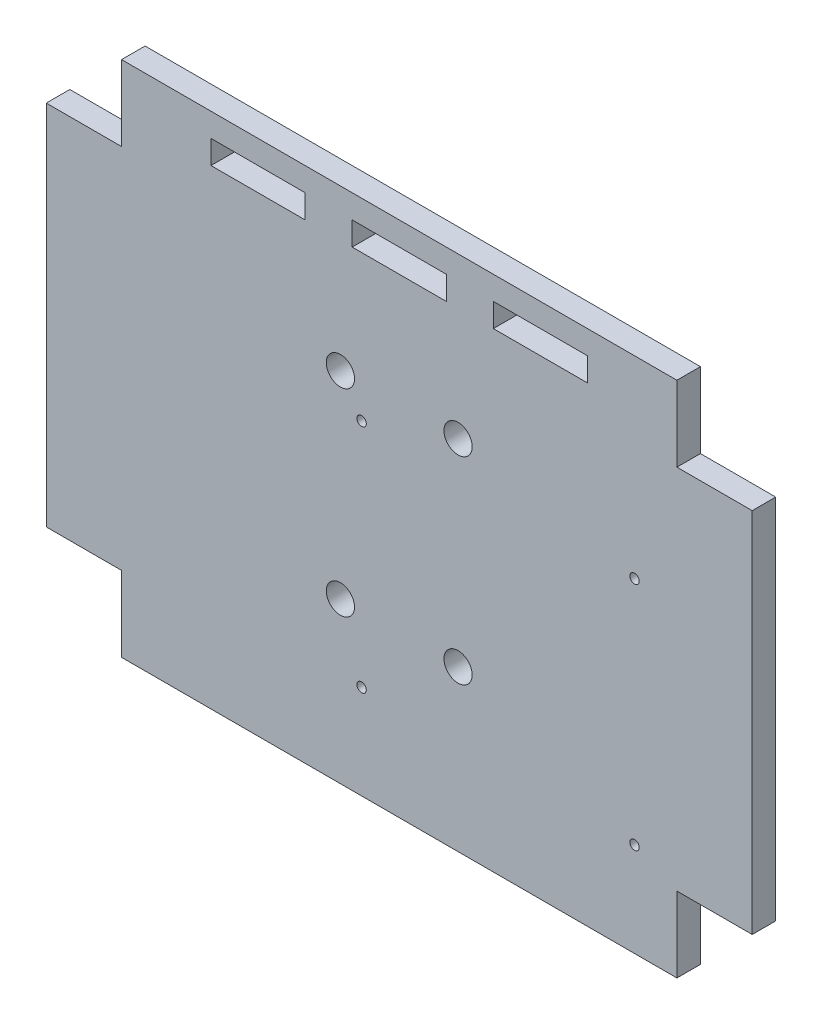
ISO-10303-21;
HEADER;
FILE_DESCRIPTION(('STEP AP214'),'2;1');
FILE_NAME('part.step','',(''),(''),'','','');
FILE_SCHEMA(('AUTOMOTIVE_DESIGN { 1 0 10303 214 1 1 1 1 }'));
ENDSEC;
DATA;
#1=APPLICATION_CONTEXT('core data for automotive mechanical design processes');
#2=APPLICATION_PROTOCOL_DEFINITION('international standard','automotive_design',2000,#1);
#3=PRODUCT_CONTEXT('',#1,'mechanical');
#4=PRODUCT('Part','Part','',(#3));
#5=PRODUCT_RELATED_PRODUCT_CATEGORY('part','',(#4));
#6=PRODUCT_DEFINITION_FORMATION('','',#4);
#7=PRODUCT_DEFINITION_CONTEXT('part definition',#1,'design');
#8=PRODUCT_DEFINITION('design','',#6,#7);
#9=PRODUCT_DEFINITION_SHAPE('','',#8);
#10=(LENGTH_UNIT() NAMED_UNIT(*) SI_UNIT(.MILLI.,.METRE.));
#11=(NAMED_UNIT(*) PLANE_ANGLE_UNIT() SI_UNIT($,.RADIAN.));
#12=(NAMED_UNIT(*) SI_UNIT($,.STERADIAN.) SOLID_ANGLE_UNIT());
#13=UNCERTAINTY_MEASURE_WITH_UNIT(LENGTH_MEASURE(1.E-05),#10,'distance_accuracy_value','');
#14=(GEOMETRIC_REPRESENTATION_CONTEXT(3) GLOBAL_UNCERTAINTY_ASSIGNED_CONTEXT((#13)) GLOBAL_UNIT_ASSIGNED_CONTEXT((#10,
#11,#12)) REPRESENTATION_CONTEXT('',''));
#15=CARTESIAN_POINT('',(0.,0.,0.));
#16=DIRECTION('',(0.,0.,1.));
#17=DIRECTION('',(1.,0.,0.));
#18=AXIS2_PLACEMENT_3D('',#15,#16,#17);
#19=CARTESIAN_POINT('',(-34.,-55.,-5.));
#20=DIRECTION('',(-1.,0.,0.));
#21=DIRECTION('',(0.,-1.,0.));
#22=AXIS2_PLACEMENT_3D('',#19,#20,#21);
#23=PLANE('',#22);
#24=DIRECTION('',(0.,-1.,0.));
#25=VECTOR('',#24,1.);
#26=CARTESIAN_POINT('',(-34.,-55.,0.));
#27=LINE('',#26,#25);
#28=CARTESIAN_POINT('',(-34.,-39.,0.));
#29=VERTEX_POINT('',#28);
#30=CARTESIAN_POINT('',(-34.,-55.,0.));
#31=VERTEX_POINT('',#30);
#32=EDGE_CURVE('E341',#29,#31,#27,.T.);
#33=ORIENTED_EDGE('',*,*,#32,.F.);
#34=DIRECTION('',(0.,0.,1.));
#35=VECTOR('',#34,1.);
#36=CARTESIAN_POINT('',(-34.,-39.,-5.));
#37=LINE('',#36,#35);
#38=CARTESIAN_POINT('',(-34.,-39.,-5.));
#39=VERTEX_POINT('',#38);
#40=EDGE_CURVE('E11',#39,#29,#37,.T.);
#41=ORIENTED_EDGE('',*,*,#40,.F.);
#42=DIRECTION('',(0.,-1.,0.));
#43=VECTOR('',#42,1.);
#44=CARTESIAN_POINT('',(-34.,-55.,-5.));
#45=LINE('',#44,#43);
#46=CARTESIAN_POINT('',(-34.,-55.,-5.));
#47=VERTEX_POINT('',#46);
#48=EDGE_CURVE('E344',#39,#47,#45,.T.);
#49=ORIENTED_EDGE('',*,*,#48,.T.);
#50=DIRECTION('',(0.,0.,1.));
#51=VECTOR('',#50,1.);
#52=CARTESIAN_POINT('',(-34.,-55.,-5.));
#53=LINE('',#52,#51);
#54=EDGE_CURVE('E36',#47,#31,#53,.T.);
#55=ORIENTED_EDGE('',*,*,#54,.T.);
#56=EDGE_LOOP('',(#33,#41,#49,#55));
#57=FACE_BOUND('',#56,.T.);
#58=ADVANCED_FACE('F33',(#57),#23,.T.);
#59=CARTESIAN_POINT('',(-50.,-39.,-5.));
#60=DIRECTION('',(0.,-1.,0.));
#61=DIRECTION('',(0.,0.,-1.));
#62=AXIS2_PLACEMENT_3D('',#59,#60,#61);
#63=PLANE('',#62);
#64=DIRECTION('',(1.,0.,0.));
#65=VECTOR('',#64,1.);
#66=CARTESIAN_POINT('',(-50.,-39.,0.));
#67=LINE('',#66,#65);
#68=CARTESIAN_POINT('',(-50.,-39.,0.));
#69=VERTEX_POINT('',#68);
#70=EDGE_CURVE('E348',#69,#29,#67,.T.);
#71=ORIENTED_EDGE('',*,*,#70,.F.);
#72=DIRECTION('',(0.,0.,1.));
#73=VECTOR('',#72,1.);
#74=CARTESIAN_POINT('',(-50.,-39.,-5.));
#75=LINE('',#74,#73);
#76=CARTESIAN_POINT('',(-50.,-39.,-5.));
#77=VERTEX_POINT('',#76);
#78=EDGE_CURVE('E41',#77,#69,#75,.T.);
#79=ORIENTED_EDGE('',*,*,#78,.F.);
#80=DIRECTION('',(1.,0.,0.));
#81=VECTOR('',#80,1.);
#82=CARTESIAN_POINT('',(-50.,-39.,-5.));
#83=LINE('',#82,#81);
#84=EDGE_CURVE('E378',#77,#39,#83,.T.);
#85=ORIENTED_EDGE('',*,*,#84,.T.);
#86=ORIENTED_EDGE('',*,*,#40,.T.);
#87=EDGE_LOOP('',(#71,#79,#85,#86));
#88=FACE_BOUND('',#87,.T.);
#89=ADVANCED_FACE('F444',(#88),#63,.T.);
#90=CARTESIAN_POINT('',(-50.,39.,-5.));
#91=DIRECTION('',(-1.,0.,0.));
#92=DIRECTION('',(0.,-1.,0.));
#93=AXIS2_PLACEMENT_3D('',#90,#91,#92);
#94=PLANE('',#93);
#95=DIRECTION('',(0.,-1.,0.));
#96=VECTOR('',#95,1.);
#97=CARTESIAN_POINT('',(-50.,39.,0.));
#98=LINE('',#97,#96);
#99=CARTESIAN_POINT('',(-50.,39.,0.));
#100=VERTEX_POINT('',#99);
#101=EDGE_CURVE('E410',#100,#69,#98,.T.);
#102=ORIENTED_EDGE('',*,*,#101,.F.);
#103=DIRECTION('',(0.,0.,1.));
#104=VECTOR('',#103,1.);
#105=CARTESIAN_POINT('',(-50.,39.,-5.));
#106=LINE('',#105,#104);
#107=CARTESIAN_POINT('',(-50.,39.,-5.));
#108=VERTEX_POINT('',#107);
#109=EDGE_CURVE('E416',#108,#100,#106,.T.);
#110=ORIENTED_EDGE('',*,*,#109,.F.);
#111=DIRECTION('',(0.,-1.,0.));
#112=VECTOR('',#111,1.);
#113=CARTESIAN_POINT('',(-50.,39.,-5.));
#114=LINE('',#113,#112);
#115=EDGE_CURVE('E375',#108,#77,#114,.T.);
#116=ORIENTED_EDGE('',*,*,#115,.T.);
#117=ORIENTED_EDGE('',*,*,#78,.T.);
#118=EDGE_LOOP('',(#102,#110,#116,#117));
#119=FACE_BOUND('',#118,.T.);
#120=ADVANCED_FACE('F481',(#119),#94,.T.);
#121=CARTESIAN_POINT('',(-50.,39.,-5.));
#122=DIRECTION('',(0.,1.,0.));
#123=DIRECTION('',(0.,0.,1.));
#124=AXIS2_PLACEMENT_3D('',#121,#122,#123);
#125=PLANE('',#124);
#126=DIRECTION('',(-1.,0.,0.));
#127=VECTOR('',#126,1.);
#128=CARTESIAN_POINT('',(-50.,39.,0.));
#129=LINE('',#128,#127);
#130=CARTESIAN_POINT('',(-34.,39.,0.));
#131=VERTEX_POINT('',#130);
#132=EDGE_CURVE('E407',#131,#100,#129,.T.);
#133=ORIENTED_EDGE('',*,*,#132,.F.);
#134=DIRECTION('',(0.,0.,1.));
#135=VECTOR('',#134,1.);
#136=CARTESIAN_POINT('',(-34.,39.,-5.));
#137=LINE('',#136,#135);
#138=CARTESIAN_POINT('',(-34.,39.,-5.));
#139=VERTEX_POINT('',#138);
#140=EDGE_CURVE('E418',#139,#131,#137,.T.);
#141=ORIENTED_EDGE('',*,*,#140,.F.);
#142=DIRECTION('',(-1.,0.,0.));
#143=VECTOR('',#142,1.);
#144=CARTESIAN_POINT('',(-50.,39.,-5.));
#145=LINE('',#144,#143);
#146=EDGE_CURVE('E372',#139,#108,#145,.T.);
#147=ORIENTED_EDGE('',*,*,#146,.T.);
#148=ORIENTED_EDGE('',*,*,#109,.T.);
#149=EDGE_LOOP('',(#133,#141,#147,#148));
#150=FACE_BOUND('',#149,.T.);
#151=ADVANCED_FACE('F478',(#150),#125,.T.);
#152=CARTESIAN_POINT('',(-34.,55.,-5.));
#153=DIRECTION('',(-1.,0.,0.));
#154=DIRECTION('',(0.,-1.,0.));
#155=AXIS2_PLACEMENT_3D('',#152,#153,#154);
#156=PLANE('',#155);
#157=DIRECTION('',(0.,-1.,0.));
#158=VECTOR('',#157,1.);
#159=CARTESIAN_POINT('',(-34.,55.,0.));
#160=LINE('',#159,#158);
#161=CARTESIAN_POINT('',(-34.,55.,0.));
#162=VERTEX_POINT('',#161);
#163=EDGE_CURVE('E404',#162,#131,#160,.T.);
#164=ORIENTED_EDGE('',*,*,#163,.F.);
#165=DIRECTION('',(0.,0.,1.));
#166=VECTOR('',#165,1.);
#167=CARTESIAN_POINT('',(-34.,55.,-5.));
#168=LINE('',#167,#166);
#169=CARTESIAN_POINT('',(-34.,55.,-5.));
#170=VERTEX_POINT('',#169);
#171=EDGE_CURVE('E420',#170,#162,#168,.T.);
#172=ORIENTED_EDGE('',*,*,#171,.F.);
#173=DIRECTION('',(0.,-1.,0.));
#174=VECTOR('',#173,1.);
#175=CARTESIAN_POINT('',(-34.,55.,-5.));
#176=LINE('',#175,#174);
#177=EDGE_CURVE('E369',#170,#139,#176,.T.);
#178=ORIENTED_EDGE('',*,*,#177,.T.);
#179=ORIENTED_EDGE('',*,*,#140,.T.);
#180=EDGE_LOOP('',(#164,#172,#178,#179));
#181=FACE_BOUND('',#180,.T.);
#182=ADVANCED_FACE('F475',(#181),#156,.T.);
#183=CARTESIAN_POINT('',(-34.,55.,-5.));
#184=DIRECTION('',(0.,1.,0.));
#185=DIRECTION('',(0.,0.,1.));
#186=AXIS2_PLACEMENT_3D('',#183,#184,#185);
#187=PLANE('',#186);
#188=DIRECTION('',(-1.,0.,0.));
#189=VECTOR('',#188,1.);
#190=CARTESIAN_POINT('',(-34.,55.,0.));
#191=LINE('',#190,#189);
#192=CARTESIAN_POINT('',(84.,55.,0.));
#193=VERTEX_POINT('',#192);
#194=EDGE_CURVE('E401',#193,#162,#191,.T.);
#195=ORIENTED_EDGE('',*,*,#194,.F.);
#196=DIRECTION('',(0.,0.,1.));
#197=VECTOR('',#196,1.);
#198=CARTESIAN_POINT('',(84.,55.,-5.));
#199=LINE('',#198,#197);
#200=CARTESIAN_POINT('',(84.,55.,-5.));
#201=VERTEX_POINT('',#200);
#202=EDGE_CURVE('E422',#201,#193,#199,.T.);
#203=ORIENTED_EDGE('',*,*,#202,.F.);
#204=DIRECTION('',(-1.,0.,0.));
#205=VECTOR('',#204,1.);
#206=CARTESIAN_POINT('',(-34.,55.,-5.));
#207=LINE('',#206,#205);
#208=EDGE_CURVE('E366',#201,#170,#207,.T.);
#209=ORIENTED_EDGE('',*,*,#208,.T.);
#210=ORIENTED_EDGE('',*,*,#171,.T.);
#211=EDGE_LOOP('',(#195,#203,#209,#210));
#212=FACE_BOUND('',#211,.T.);
#213=ADVANCED_FACE('F471',(#212),#187,.T.);
#214=CARTESIAN_POINT('',(84.,55.,-5.));
#215=DIRECTION('',(1.,0.,0.));
#216=DIRECTION('',(0.,1.,0.));
#217=AXIS2_PLACEMENT_3D('',#214,#215,#216);
#218=PLANE('',#217);
#219=DIRECTION('',(0.,1.,0.));
#220=VECTOR('',#219,1.);
#221=CARTESIAN_POINT('',(84.,55.,0.));
#222=LINE('',#221,#220);
#223=CARTESIAN_POINT('',(84.,39.,0.));
#224=VERTEX_POINT('',#223);
#225=EDGE_CURVE('E398',#224,#193,#222,.T.);
#226=ORIENTED_EDGE('',*,*,#225,.F.);
#227=DIRECTION('',(0.,0.,1.));
#228=VECTOR('',#227,1.);
#229=CARTESIAN_POINT('',(84.,39.,-5.));
#230=LINE('',#229,#228);
#231=CARTESIAN_POINT('',(84.,39.,-5.));
#232=VERTEX_POINT('',#231);
#233=EDGE_CURVE('E424',#232,#224,#230,.T.);
#234=ORIENTED_EDGE('',*,*,#233,.F.);
#235=DIRECTION('',(0.,1.,0.));
#236=VECTOR('',#235,1.);
#237=CARTESIAN_POINT('',(84.,55.,-5.));
#238=LINE('',#237,#236);
#239=EDGE_CURVE('E363',#232,#201,#238,.T.);
#240=ORIENTED_EDGE('',*,*,#239,.T.);
#241=ORIENTED_EDGE('',*,*,#202,.T.);
#242=EDGE_LOOP('',(#226,#234,#240,#241));
#243=FACE_BOUND('',#242,.T.);
#244=ADVANCED_FACE('F467',(#243),#218,.T.);
#245=CARTESIAN_POINT('',(100.,39.,-5.));
#246=DIRECTION('',(0.,1.,0.));
#247=DIRECTION('',(0.,0.,1.));
#248=AXIS2_PLACEMENT_3D('',#245,#246,#247);
#249=PLANE('',#248);
#250=DIRECTION('',(-1.,0.,0.));
#251=VECTOR('',#250,1.);
#252=CARTESIAN_POINT('',(100.,39.,0.));
#253=LINE('',#252,#251);
#254=CARTESIAN_POINT('',(100.,39.,0.));
#255=VERTEX_POINT('',#254);
#256=EDGE_CURVE('E395',#255,#224,#253,.T.);
#257=ORIENTED_EDGE('',*,*,#256,.F.);
#258=DIRECTION('',(0.,0.,1.));
#259=VECTOR('',#258,1.);
#260=CARTESIAN_POINT('',(100.,39.,-5.));
#261=LINE('',#260,#259);
#262=CARTESIAN_POINT('',(100.,39.,-5.));
#263=VERTEX_POINT('',#262);
#264=EDGE_CURVE('E426',#263,#255,#261,.T.);
#265=ORIENTED_EDGE('',*,*,#264,.F.);
#266=DIRECTION('',(-1.,0.,0.));
#267=VECTOR('',#266,1.);
#268=CARTESIAN_POINT('',(100.,39.,-5.));
#269=LINE('',#268,#267);
#270=EDGE_CURVE('E360',#263,#232,#269,.T.);
#271=ORIENTED_EDGE('',*,*,#270,.T.);
#272=ORIENTED_EDGE('',*,*,#233,.T.);
#273=EDGE_LOOP('',(#257,#265,#271,#272));
#274=FACE_BOUND('',#273,.T.);
#275=ADVANCED_FACE('F463',(#274),#249,.T.);
#276=CARTESIAN_POINT('',(100.,39.,-5.));
#277=DIRECTION('',(1.,0.,0.));
#278=DIRECTION('',(0.,1.,0.));
#279=AXIS2_PLACEMENT_3D('',#276,#277,#278);
#280=PLANE('',#279);
#281=DIRECTION('',(0.,1.,0.));
#282=VECTOR('',#281,1.);
#283=CARTESIAN_POINT('',(100.,39.,0.));
#284=LINE('',#283,#282);
#285=CARTESIAN_POINT('',(100.,-39.,0.));
#286=VERTEX_POINT('',#285);
#287=EDGE_CURVE('E392',#286,#255,#284,.T.);
#288=ORIENTED_EDGE('',*,*,#287,.F.);
#289=DIRECTION('',(0.,0.,1.));
#290=VECTOR('',#289,1.);
#291=CARTESIAN_POINT('',(100.,-39.,-5.));
#292=LINE('',#291,#290);
#293=CARTESIAN_POINT('',(100.,-39.,-5.));
#294=VERTEX_POINT('',#293);
#295=EDGE_CURVE('E428',#294,#286,#292,.T.);
#296=ORIENTED_EDGE('',*,*,#295,.F.);
#297=DIRECTION('',(0.,1.,0.));
#298=VECTOR('',#297,1.);
#299=CARTESIAN_POINT('',(100.,39.,-5.));
#300=LINE('',#299,#298);
#301=EDGE_CURVE('E357',#294,#263,#300,.T.);
#302=ORIENTED_EDGE('',*,*,#301,.T.);
#303=ORIENTED_EDGE('',*,*,#264,.T.);
#304=EDGE_LOOP('',(#288,#296,#302,#303));
#305=FACE_BOUND('',#304,.T.);
#306=ADVANCED_FACE('F459',(#305),#280,.T.);
#307=CARTESIAN_POINT('',(100.,-39.,-5.));
#308=DIRECTION('',(0.,-1.,0.));
#309=DIRECTION('',(0.,0.,-1.));
#310=AXIS2_PLACEMENT_3D('',#307,#308,#309);
#311=PLANE('',#310);
#312=DIRECTION('',(1.,0.,0.));
#313=VECTOR('',#312,1.);
#314=CARTESIAN_POINT('',(100.,-39.,0.));
#315=LINE('',#314,#313);
#316=CARTESIAN_POINT('',(84.,-39.,0.));
#317=VERTEX_POINT('',#316);
#318=EDGE_CURVE('E389',#317,#286,#315,.T.);
#319=ORIENTED_EDGE('',*,*,#318,.F.);
#320=DIRECTION('',(0.,0.,1.));
#321=VECTOR('',#320,1.);
#322=CARTESIAN_POINT('',(84.,-39.,-5.));
#323=LINE('',#322,#321);
#324=CARTESIAN_POINT('',(84.,-39.,-5.));
#325=VERTEX_POINT('',#324);
#326=EDGE_CURVE('E430',#325,#317,#323,.T.);
#327=ORIENTED_EDGE('',*,*,#326,.F.);
#328=DIRECTION('',(1.,0.,0.));
#329=VECTOR('',#328,1.);
#330=CARTESIAN_POINT('',(100.,-39.,-5.));
#331=LINE('',#330,#329);
#332=EDGE_CURVE('E354',#325,#294,#331,.T.);
#333=ORIENTED_EDGE('',*,*,#332,.T.);
#334=ORIENTED_EDGE('',*,*,#295,.T.);
#335=EDGE_LOOP('',(#319,#327,#333,#334));
#336=FACE_BOUND('',#335,.T.);
#337=ADVANCED_FACE('F457',(#336),#311,.T.);
#338=CARTESIAN_POINT('',(84.,-55.,-5.));
#339=DIRECTION('',(1.,0.,0.));
#340=DIRECTION('',(0.,0.,-1.));
#341=AXIS2_PLACEMENT_3D('',#338,#339,#340);
#342=PLANE('',#341);
#343=DIRECTION('',(0.,1.,0.));
#344=VECTOR('',#343,1.);
#345=CARTESIAN_POINT('',(84.,-55.,0.));
#346=LINE('',#345,#344);
#347=CARTESIAN_POINT('',(84.,-55.,0.));
#348=VERTEX_POINT('',#347);
#349=EDGE_CURVE('E386',#348,#317,#346,.T.);
#350=ORIENTED_EDGE('',*,*,#349,.F.);
#351=DIRECTION('',(0.,0.,1.));
#352=VECTOR('',#351,1.);
#353=CARTESIAN_POINT('',(84.,-55.,-5.));
#354=LINE('',#353,#352);
#355=CARTESIAN_POINT('',(84.,-55.,-5.));
#356=VERTEX_POINT('',#355);
#357=EDGE_CURVE('E431',#356,#348,#354,.T.);
#358=ORIENTED_EDGE('',*,*,#357,.F.);
#359=DIRECTION('',(0.,1.,0.));
#360=VECTOR('',#359,1.);
#361=CARTESIAN_POINT('',(84.,-55.,-5.));
#362=LINE('',#361,#360);
#363=EDGE_CURVE('E351',#356,#325,#362,.T.);
#364=ORIENTED_EDGE('',*,*,#363,.T.);
#365=ORIENTED_EDGE('',*,*,#326,.T.);
#366=EDGE_LOOP('',(#350,#358,#364,#365));
#367=FACE_BOUND('',#366,.T.);
#368=ADVANCED_FACE('F453',(#367),#342,.T.);
#369=CARTESIAN_POINT('',(-34.,-55.,-5.));
#370=DIRECTION('',(0.,-1.,0.));
#371=DIRECTION('',(0.,0.,-1.));
#372=AXIS2_PLACEMENT_3D('',#369,#370,#371);
#373=PLANE('',#372);
#374=DIRECTION('',(1.,0.,0.));
#375=VECTOR('',#374,1.);
#376=CARTESIAN_POINT('',(-34.,-55.,0.));
#377=LINE('',#376,#375);
#378=EDGE_CURVE('E383',#31,#348,#377,.T.);
#379=ORIENTED_EDGE('',*,*,#378,.F.);
#380=ORIENTED_EDGE('',*,*,#54,.F.);
#381=DIRECTION('',(1.,0.,0.));
#382=VECTOR('',#381,1.);
#383=CARTESIAN_POINT('',(-34.,-55.,-5.));
#384=LINE('',#383,#382);
#385=EDGE_CURVE('E347',#47,#356,#384,.T.);
#386=ORIENTED_EDGE('',*,*,#385,.T.);
#387=ORIENTED_EDGE('',*,*,#357,.T.);
#388=EDGE_LOOP('',(#379,#380,#386,#387));
#389=FACE_BOUND('',#388,.T.);
#390=ADVANCED_FACE('F439',(#389),#373,.T.);
#391=CARTESIAN_POINT('',(0.,0.,-5.));
#392=DIRECTION('',(0.,0.,-1.));
#393=DIRECTION('',(-1.,0.,0.));
#394=AXIS2_PLACEMENT_3D('',#391,#392,#393);
#395=PLANE('',#394);
#396=DIRECTION('',(0.,-1.,0.));
#397=VECTOR('',#396,1.);
#398=CARTESIAN_POINT('',(65.,45.,-5.));
#399=LINE('',#398,#397);
#400=CARTESIAN_POINT('',(65.,50.,-5.));
#401=VERTEX_POINT('',#400);
#402=CARTESIAN_POINT('',(65.,45.,-5.));
#403=VERTEX_POINT('',#402);
#404=EDGE_CURVE('E49',#401,#403,#399,.T.);
#405=ORIENTED_EDGE('',*,*,#404,.F.);
#406=DIRECTION('',(1.,0.,0.));
#407=VECTOR('',#406,1.);
#408=CARTESIAN_POINT('',(65.,50.,-5.));
#409=LINE('',#408,#407);
#410=CARTESIAN_POINT('',(45.,50.,-5.));
#411=VERTEX_POINT('',#410);
#412=EDGE_CURVE('E215',#411,#401,#409,.T.);
#413=ORIENTED_EDGE('',*,*,#412,.F.);
#414=DIRECTION('',(0.,1.,0.));
#415=VECTOR('',#414,1.);
#416=CARTESIAN_POINT('',(45.,45.,-5.));
#417=LINE('',#416,#415);
#418=CARTESIAN_POINT('',(45.,45.,-5.));
#419=VERTEX_POINT('',#418);
#420=EDGE_CURVE('E218',#419,#411,#417,.T.);
#421=ORIENTED_EDGE('',*,*,#420,.F.);
#422=DIRECTION('',(-1.,0.,0.));
#423=VECTOR('',#422,1.);
#424=CARTESIAN_POINT('',(65.,45.,-5.));
#425=LINE('',#424,#423);
#426=EDGE_CURVE('E224',#403,#419,#425,.T.);
#427=ORIENTED_EDGE('',*,*,#426,.F.);
#428=EDGE_LOOP('',(#405,#413,#421,#427));
#429=FACE_BOUND('',#428,.T.);
#430=DIRECTION('',(0.,-1.,0.));
#431=VECTOR('',#430,1.);
#432=CARTESIAN_POINT('',(35.,45.,-5.));
#433=LINE('',#432,#431);
#434=CARTESIAN_POINT('',(35.,50.,-5.));
#435=VERTEX_POINT('',#434);
#436=CARTESIAN_POINT('',(35.,45.,-5.));
#437=VERTEX_POINT('',#436);
#438=EDGE_CURVE('E57',#435,#437,#433,.T.);
#439=ORIENTED_EDGE('',*,*,#438,.F.);
#440=DIRECTION('',(1.,0.,0.));
#441=VECTOR('',#440,1.);
#442=CARTESIAN_POINT('',(35.,50.,-5.));
#443=LINE('',#442,#441);
#444=CARTESIAN_POINT('',(15.,50.,-5.));
#445=VERTEX_POINT('',#444);
#446=EDGE_CURVE('E239',#445,#435,#443,.T.);
#447=ORIENTED_EDGE('',*,*,#446,.F.);
#448=DIRECTION('',(0.,1.,0.));
#449=VECTOR('',#448,1.);
#450=CARTESIAN_POINT('',(15.,45.,-5.));
#451=LINE('',#450,#449);
#452=CARTESIAN_POINT('',(15.,45.,-5.));
#453=VERTEX_POINT('',#452);
#454=EDGE_CURVE('E254',#453,#445,#451,.T.);
#455=ORIENTED_EDGE('',*,*,#454,.F.);
#456=DIRECTION('',(-1.,0.,0.));
#457=VECTOR('',#456,1.);
#458=CARTESIAN_POINT('',(35.,45.,-5.));
#459=LINE('',#458,#457);
#460=EDGE_CURVE('E250',#437,#453,#459,.T.);
#461=ORIENTED_EDGE('',*,*,#460,.F.);
#462=EDGE_LOOP('',(#439,#447,#455,#461));
#463=FACE_BOUND('',#462,.T.);
#464=DIRECTION('',(0.,-1.,0.));
#465=VECTOR('',#464,1.);
#466=CARTESIAN_POINT('',(5.,45.,-5.));
#467=LINE('',#466,#465);
#468=CARTESIAN_POINT('',(5.,50.,-5.));
#469=VERTEX_POINT('',#468);
#470=CARTESIAN_POINT('',(5.,45.,-5.));
#471=VERTEX_POINT('',#470);
#472=EDGE_CURVE('E279',#469,#471,#467,.T.);
#473=ORIENTED_EDGE('',*,*,#472,.F.);
#474=DIRECTION('',(1.,0.,0.));
#475=VECTOR('',#474,1.);
#476=CARTESIAN_POINT('',(5.,50.,-5.));
#477=LINE('',#476,#475);
#478=CARTESIAN_POINT('',(-15.,50.,-5.));
#479=VERTEX_POINT('',#478);
#480=EDGE_CURVE('E269',#479,#469,#477,.T.);
#481=ORIENTED_EDGE('',*,*,#480,.F.);
#482=DIRECTION('',(0.,1.,0.));
#483=VECTOR('',#482,1.);
#484=CARTESIAN_POINT('',(-15.,45.,-5.));
#485=LINE('',#484,#483);
#486=CARTESIAN_POINT('',(-15.,45.,-5.));
#487=VERTEX_POINT('',#486);
#488=EDGE_CURVE('E284',#487,#479,#485,.T.);
#489=ORIENTED_EDGE('',*,*,#488,.F.);
#490=DIRECTION('',(-1.,0.,0.));
#491=VECTOR('',#490,1.);
#492=CARTESIAN_POINT('',(5.,45.,-5.));
#493=LINE('',#492,#491);
#494=EDGE_CURVE('E281',#471,#487,#493,.T.);
#495=ORIENTED_EDGE('',*,*,#494,.F.);
#496=EDGE_LOOP('',(#473,#481,#489,#495));
#497=FACE_BOUND('',#496,.T.);
#498=CARTESIAN_POINT('',(12.5,-21.,-5.));
#499=DIRECTION('',(0.,0.,-1.));
#500=DIRECTION('',(-1.,0.,0.));
#501=AXIS2_PLACEMENT_3D('',#498,#499,#500);
#502=CIRCLE('',#501,3.);
#503=CARTESIAN_POINT('',(9.50000000000001,-21.,-5.));
#504=VERTEX_POINT('',#503);
#505=EDGE_CURVE('E231',#504,#504,#502,.T.);
#506=ORIENTED_EDGE('',*,*,#505,.F.);
#507=EDGE_LOOP('',(#506));
#508=FACE_BOUND('',#507,.T.);
#509=CARTESIAN_POINT('',(12.5,21.,-5.));
#510=DIRECTION('',(0.,0.,-1.));
#511=DIRECTION('',(-1.,0.,0.));
#512=AXIS2_PLACEMENT_3D('',#509,#510,#511);
#513=CIRCLE('',#512,3.);
#514=CARTESIAN_POINT('',(9.50000000000001,21.,-5.));
#515=VERTEX_POINT('',#514);
#516=EDGE_CURVE('E306',#515,#515,#513,.T.);
#517=ORIENTED_EDGE('',*,*,#516,.F.);
#518=EDGE_LOOP('',(#517));
#519=FACE_BOUND('',#518,.T.);
#520=CARTESIAN_POINT('',(37.5,21.,-5.));
#521=DIRECTION('',(0.,0.,-1.));
#522=DIRECTION('',(-1.,0.,0.));
#523=AXIS2_PLACEMENT_3D('',#520,#521,#522);
#524=CIRCLE('',#523,3.);
#525=CARTESIAN_POINT('',(34.5,21.,-5.));
#526=VERTEX_POINT('',#525);
#527=EDGE_CURVE('E300',#526,#526,#524,.T.);
#528=ORIENTED_EDGE('',*,*,#527,.F.);
#529=EDGE_LOOP('',(#528));
#530=FACE_BOUND('',#529,.T.);
#531=CARTESIAN_POINT('',(37.5,-21.,-5.));
#532=DIRECTION('',(0.,0.,-1.));
#533=DIRECTION('',(-1.,0.,0.));
#534=AXIS2_PLACEMENT_3D('',#531,#532,#533);
#535=CIRCLE('',#534,3.);
#536=CARTESIAN_POINT('',(34.5,-21.,-5.));
#537=VERTEX_POINT('',#536);
#538=EDGE_CURVE('E299',#537,#537,#535,.T.);
#539=ORIENTED_EDGE('',*,*,#538,.F.);
#540=EDGE_LOOP('',(#539));
#541=FACE_BOUND('',#540,.T.);
#542=CARTESIAN_POINT('',(17.,-35.,-5.));
#543=DIRECTION('',(0.,0.,-1.));
#544=DIRECTION('',(-1.,0.,0.));
#545=AXIS2_PLACEMENT_3D('',#542,#543,#544);
#546=CIRCLE('',#545,1.);
#547=CARTESIAN_POINT('',(16.,-35.,-5.));
#548=VERTEX_POINT('',#547);
#549=EDGE_CURVE('E330',#548,#548,#546,.T.);
#550=ORIENTED_EDGE('',*,*,#549,.F.);
#551=EDGE_LOOP('',(#550));
#552=FACE_BOUND('',#551,.T.);
#553=CARTESIAN_POINT('',(75.,14.,-5.));
#554=DIRECTION('',(0.,0.,-1.));
#555=DIRECTION('',(-1.,0.,0.));
#556=AXIS2_PLACEMENT_3D('',#553,#554,#555);
#557=CIRCLE('',#556,0.999999999999998);
#558=CARTESIAN_POINT('',(74.,14.,-5.));
#559=VERTEX_POINT('',#558);
#560=EDGE_CURVE('E323',#559,#559,#557,.T.);
#561=ORIENTED_EDGE('',*,*,#560,.F.);
#562=EDGE_LOOP('',(#561));
#563=FACE_BOUND('',#562,.T.);
#564=CARTESIAN_POINT('',(17.,14.,-5.));
#565=DIRECTION('',(0.,0.,-1.));
#566=DIRECTION('',(-1.,0.,0.));
#567=AXIS2_PLACEMENT_3D('',#564,#565,#566);
#568=CIRCLE('',#567,1.);
#569=CARTESIAN_POINT('',(16.,14.,-5.));
#570=VERTEX_POINT('',#569);
#571=EDGE_CURVE('E317',#570,#570,#568,.T.);
#572=ORIENTED_EDGE('',*,*,#571,.F.);
#573=EDGE_LOOP('',(#572));
#574=FACE_BOUND('',#573,.T.);
#575=CARTESIAN_POINT('',(75.,-35.,-5.));
#576=DIRECTION('',(0.,0.,-1.));
#577=DIRECTION('',(-1.,0.,0.));
#578=AXIS2_PLACEMENT_3D('',#575,#576,#577);
#579=CIRCLE('',#578,0.999999999999998);
#580=CARTESIAN_POINT('',(74.,-35.,-5.));
#581=VERTEX_POINT('',#580);
#582=EDGE_CURVE('E329',#581,#581,#579,.T.);
#583=ORIENTED_EDGE('',*,*,#582,.F.);
#584=EDGE_LOOP('',(#583));
#585=FACE_BOUND('',#584,.T.);
#586=ORIENTED_EDGE('',*,*,#48,.F.);
#587=ORIENTED_EDGE('',*,*,#84,.F.);
#588=ORIENTED_EDGE('',*,*,#115,.F.);
#589=ORIENTED_EDGE('',*,*,#146,.F.);
#590=ORIENTED_EDGE('',*,*,#177,.F.);
#591=ORIENTED_EDGE('',*,*,#208,.F.);
#592=ORIENTED_EDGE('',*,*,#239,.F.);
#593=ORIENTED_EDGE('',*,*,#270,.F.);
#594=ORIENTED_EDGE('',*,*,#301,.F.);
#595=ORIENTED_EDGE('',*,*,#332,.F.);
#596=ORIENTED_EDGE('',*,*,#363,.F.);
#597=ORIENTED_EDGE('',*,*,#385,.F.);
#598=EDGE_LOOP('',(#586,#587,#588,#589,#590,#591,#592,#593,#594,#595,#596,#597));
#599=FACE_BOUND('',#598,.T.);
#600=ADVANCED_FACE('F447',(#429,#463,#497,#508,#519,#530,#541,#552,#563,#574,#585,#599),#395,.T.);
#601=CARTESIAN_POINT('',(0.,0.,0.));
#602=DIRECTION('',(0.,0.,-1.));
#603=DIRECTION('',(-1.,0.,0.));
#604=AXIS2_PLACEMENT_3D('',#601,#602,#603);
#605=PLANE('',#604);
#606=DIRECTION('',(1.,0.,0.));
#607=VECTOR('',#606,1.);
#608=CARTESIAN_POINT('',(65.,50.,0.));
#609=LINE('',#608,#607);
#610=CARTESIAN_POINT('',(45.,50.,0.));
#611=VERTEX_POINT('',#610);
#612=CARTESIAN_POINT('',(65.,50.,0.));
#613=VERTEX_POINT('',#612);
#614=EDGE_CURVE('E202',#611,#613,#609,.T.);
#615=ORIENTED_EDGE('',*,*,#614,.T.);
#616=DIRECTION('',(0.,-1.,0.));
#617=VECTOR('',#616,1.);
#618=CARTESIAN_POINT('',(65.,45.,0.));
#619=LINE('',#618,#617);
#620=CARTESIAN_POINT('',(65.,45.,0.));
#621=VERTEX_POINT('',#620);
#622=EDGE_CURVE('E196',#613,#621,#619,.T.);
#623=ORIENTED_EDGE('',*,*,#622,.T.);
#624=DIRECTION('',(-1.,0.,0.));
#625=VECTOR('',#624,1.);
#626=CARTESIAN_POINT('',(65.,45.,0.));
#627=LINE('',#626,#625);
#628=CARTESIAN_POINT('',(45.,45.,0.));
#629=VERTEX_POINT('',#628);
#630=EDGE_CURVE('E206',#621,#629,#627,.T.);
#631=ORIENTED_EDGE('',*,*,#630,.T.);
#632=DIRECTION('',(0.,1.,0.));
#633=VECTOR('',#632,1.);
#634=CARTESIAN_POINT('',(45.,45.,0.));
#635=LINE('',#634,#633);
#636=EDGE_CURVE('E210',#629,#611,#635,.T.);
#637=ORIENTED_EDGE('',*,*,#636,.T.);
#638=EDGE_LOOP('',(#615,#623,#631,#637));
#639=FACE_BOUND('',#638,.T.);
#640=DIRECTION('',(1.,0.,0.));
#641=VECTOR('',#640,1.);
#642=CARTESIAN_POINT('',(35.,50.,0.));
#643=LINE('',#642,#641);
#644=CARTESIAN_POINT('',(15.,50.,0.));
#645=VERTEX_POINT('',#644);
#646=CARTESIAN_POINT('',(35.,50.,0.));
#647=VERTEX_POINT('',#646);
#648=EDGE_CURVE('E245',#645,#647,#643,.T.);
#649=ORIENTED_EDGE('',*,*,#648,.T.);
#650=DIRECTION('',(0.,-1.,0.));
#651=VECTOR('',#650,1.);
#652=CARTESIAN_POINT('',(35.,45.,0.));
#653=LINE('',#652,#651);
#654=CARTESIAN_POINT('',(35.,45.,0.));
#655=VERTEX_POINT('',#654);
#656=EDGE_CURVE('E235',#647,#655,#653,.T.);
#657=ORIENTED_EDGE('',*,*,#656,.T.);
#658=DIRECTION('',(-1.,0.,0.));
#659=VECTOR('',#658,1.);
#660=CARTESIAN_POINT('',(35.,45.,0.));
#661=LINE('',#660,#659);
#662=CARTESIAN_POINT('',(15.,45.,0.));
#663=VERTEX_POINT('',#662);
#664=EDGE_CURVE('E238',#655,#663,#661,.T.);
#665=ORIENTED_EDGE('',*,*,#664,.T.);
#666=DIRECTION('',(0.,1.,0.));
#667=VECTOR('',#666,1.);
#668=CARTESIAN_POINT('',(15.,45.,0.));
#669=LINE('',#668,#667);
#670=EDGE_CURVE('E242',#663,#645,#669,.T.);
#671=ORIENTED_EDGE('',*,*,#670,.T.);
#672=EDGE_LOOP('',(#649,#657,#665,#671));
#673=FACE_BOUND('',#672,.T.);
#674=DIRECTION('',(1.,0.,0.));
#675=VECTOR('',#674,1.);
#676=CARTESIAN_POINT('',(5.,50.,0.));
#677=LINE('',#676,#675);
#678=CARTESIAN_POINT('',(-15.,50.,0.));
#679=VERTEX_POINT('',#678);
#680=CARTESIAN_POINT('',(5.,50.,0.));
#681=VERTEX_POINT('',#680);
#682=EDGE_CURVE('E275',#679,#681,#677,.T.);
#683=ORIENTED_EDGE('',*,*,#682,.T.);
#684=DIRECTION('',(0.,-1.,0.));
#685=VECTOR('',#684,1.);
#686=CARTESIAN_POINT('',(5.,45.,0.));
#687=LINE('',#686,#685);
#688=CARTESIAN_POINT('',(5.,45.,0.));
#689=VERTEX_POINT('',#688);
#690=EDGE_CURVE('E265',#681,#689,#687,.T.);
#691=ORIENTED_EDGE('',*,*,#690,.T.);
#692=DIRECTION('',(-1.,0.,0.));
#693=VECTOR('',#692,1.);
#694=CARTESIAN_POINT('',(5.,45.,0.));
#695=LINE('',#694,#693);
#696=CARTESIAN_POINT('',(-15.,45.,0.));
#697=VERTEX_POINT('',#696);
#698=EDGE_CURVE('E268',#689,#697,#695,.T.);
#699=ORIENTED_EDGE('',*,*,#698,.T.);
#700=DIRECTION('',(0.,1.,0.));
#701=VECTOR('',#700,1.);
#702=CARTESIAN_POINT('',(-15.,45.,0.));
#703=LINE('',#702,#701);
#704=EDGE_CURVE('E272',#697,#679,#703,.T.);
#705=ORIENTED_EDGE('',*,*,#704,.T.);
#706=EDGE_LOOP('',(#683,#691,#699,#705));
#707=FACE_BOUND('',#706,.T.);
#708=CARTESIAN_POINT('',(12.5,-21.,0.));
#709=DIRECTION('',(0.,0.,-1.));
#710=DIRECTION('',(-1.,0.,0.));
#711=AXIS2_PLACEMENT_3D('',#708,#709,#710);
#712=CIRCLE('',#711,3.);
#713=CARTESIAN_POINT('',(9.50000000000001,-21.,0.));
#714=VERTEX_POINT('',#713);
#715=EDGE_CURVE('E309',#714,#714,#712,.T.);
#716=ORIENTED_EDGE('',*,*,#715,.T.);
#717=EDGE_LOOP('',(#716));
#718=FACE_BOUND('',#717,.T.);
#719=CARTESIAN_POINT('',(12.5,21.,0.));
#720=DIRECTION('',(0.,0.,-1.));
#721=DIRECTION('',(-1.,0.,0.));
#722=AXIS2_PLACEMENT_3D('',#719,#720,#721);
#723=CIRCLE('',#722,3.);
#724=CARTESIAN_POINT('',(9.50000000000001,21.,0.));
#725=VERTEX_POINT('',#724);
#726=EDGE_CURVE('E303',#725,#725,#723,.T.);
#727=ORIENTED_EDGE('',*,*,#726,.T.);
#728=EDGE_LOOP('',(#727));
#729=FACE_BOUND('',#728,.T.);
#730=CARTESIAN_POINT('',(37.5,21.,0.));
#731=DIRECTION('',(0.,0.,-1.));
#732=DIRECTION('',(-1.,0.,0.));
#733=AXIS2_PLACEMENT_3D('',#730,#731,#732);
#734=CIRCLE('',#733,3.);
#735=CARTESIAN_POINT('',(34.5,21.,0.));
#736=VERTEX_POINT('',#735);
#737=EDGE_CURVE('E296',#736,#736,#734,.T.);
#738=ORIENTED_EDGE('',*,*,#737,.T.);
#739=EDGE_LOOP('',(#738));
#740=FACE_BOUND('',#739,.T.);
#741=CARTESIAN_POINT('',(37.5,-21.,0.));
#742=DIRECTION('',(0.,0.,-1.));
#743=DIRECTION('',(-1.,0.,0.));
#744=AXIS2_PLACEMENT_3D('',#741,#742,#743);
#745=CIRCLE('',#744,3.);
#746=CARTESIAN_POINT('',(34.5,-21.,0.));
#747=VERTEX_POINT('',#746);
#748=EDGE_CURVE('E314',#747,#747,#745,.T.);
#749=ORIENTED_EDGE('',*,*,#748,.T.);
#750=EDGE_LOOP('',(#749));
#751=FACE_BOUND('',#750,.T.);
#752=CARTESIAN_POINT('',(17.,-35.,0.));
#753=DIRECTION('',(0.,0.,-1.));
#754=DIRECTION('',(-1.,0.,0.));
#755=AXIS2_PLACEMENT_3D('',#752,#753,#754);
#756=CIRCLE('',#755,1.);
#757=CARTESIAN_POINT('',(16.,-35.,0.));
#758=VERTEX_POINT('',#757);
#759=EDGE_CURVE('E326',#758,#758,#756,.T.);
#760=ORIENTED_EDGE('',*,*,#759,.T.);
#761=EDGE_LOOP('',(#760));
#762=FACE_BOUND('',#761,.T.);
#763=CARTESIAN_POINT('',(75.,14.,0.));
#764=DIRECTION('',(0.,0.,-1.));
#765=DIRECTION('',(-1.,0.,0.));
#766=AXIS2_PLACEMENT_3D('',#763,#764,#765);
#767=CIRCLE('',#766,0.999999999999998);
#768=CARTESIAN_POINT('',(74.,14.,0.));
#769=VERTEX_POINT('',#768);
#770=EDGE_CURVE('E333',#769,#769,#767,.T.);
#771=ORIENTED_EDGE('',*,*,#770,.T.);
#772=EDGE_LOOP('',(#771));
#773=FACE_BOUND('',#772,.T.);
#774=CARTESIAN_POINT('',(17.,14.,0.));
#775=DIRECTION('',(0.,0.,-1.));
#776=DIRECTION('',(-1.,0.,0.));
#777=AXIS2_PLACEMENT_3D('',#774,#775,#776);
#778=CIRCLE('',#777,1.);
#779=CARTESIAN_POINT('',(16.,14.,0.));
#780=VERTEX_POINT('',#779);
#781=EDGE_CURVE('E320',#780,#780,#778,.T.);
#782=ORIENTED_EDGE('',*,*,#781,.T.);
#783=EDGE_LOOP('',(#782));
#784=FACE_BOUND('',#783,.T.);
#785=CARTESIAN_POINT('',(75.,-35.,0.));
#786=DIRECTION('',(0.,0.,-1.));
#787=DIRECTION('',(-1.,0.,0.));
#788=AXIS2_PLACEMENT_3D('',#785,#786,#787);
#789=CIRCLE('',#788,0.999999999999998);
#790=CARTESIAN_POINT('',(74.,-35.,0.));
#791=VERTEX_POINT('',#790);
#792=EDGE_CURVE('E338',#791,#791,#789,.T.);
#793=ORIENTED_EDGE('',*,*,#792,.T.);
#794=EDGE_LOOP('',(#793));
#795=FACE_BOUND('',#794,.T.);
#796=ORIENTED_EDGE('',*,*,#32,.T.);
#797=ORIENTED_EDGE('',*,*,#378,.T.);
#798=ORIENTED_EDGE('',*,*,#349,.T.);
#799=ORIENTED_EDGE('',*,*,#318,.T.);
#800=ORIENTED_EDGE('',*,*,#287,.T.);
#801=ORIENTED_EDGE('',*,*,#256,.T.);
#802=ORIENTED_EDGE('',*,*,#225,.T.);
#803=ORIENTED_EDGE('',*,*,#194,.T.);
#804=ORIENTED_EDGE('',*,*,#163,.T.);
#805=ORIENTED_EDGE('',*,*,#132,.T.);
#806=ORIENTED_EDGE('',*,*,#101,.T.);
#807=ORIENTED_EDGE('',*,*,#70,.T.);
#808=EDGE_LOOP('',(#796,#797,#798,#799,#800,#801,#802,#803,#804,#805,#806,#807));
#809=FACE_BOUND('',#808,.T.);
#810=ADVANCED_FACE('F212',(#639,#673,#707,#718,#729,#740,#751,#762,#773,#784,#795,#809),#605,.F.);
#811=CARTESIAN_POINT('',(75.,-35.,0.));
#812=DIRECTION('',(0.,0.,-1.));
#813=DIRECTION('',(-1.,0.,0.));
#814=AXIS2_PLACEMENT_3D('',#811,#812,#813);
#815=CYLINDRICAL_SURFACE('',#814,0.999999999999998);
#816=ORIENTED_EDGE('',*,*,#792,.F.);
#817=EDGE_LOOP('',(#816));
#818=FACE_BOUND('',#817,.T.);
#819=ORIENTED_EDGE('',*,*,#582,.T.);
#820=EDGE_LOOP('',(#819));
#821=FACE_BOUND('',#820,.T.);
#822=ADVANCED_FACE('F577',(#818,#821),#815,.F.);
#823=CARTESIAN_POINT('',(17.,14.,0.));
#824=DIRECTION('',(0.,0.,-1.));
#825=DIRECTION('',(-1.,0.,0.));
#826=AXIS2_PLACEMENT_3D('',#823,#824,#825);
#827=CYLINDRICAL_SURFACE('',#826,1.);
#828=ORIENTED_EDGE('',*,*,#781,.F.);
#829=EDGE_LOOP('',(#828));
#830=FACE_BOUND('',#829,.T.);
#831=ORIENTED_EDGE('',*,*,#571,.T.);
#832=EDGE_LOOP('',(#831));
#833=FACE_BOUND('',#832,.T.);
#834=ADVANCED_FACE('F582',(#830,#833),#827,.F.);
#835=CARTESIAN_POINT('',(75.,14.,0.));
#836=DIRECTION('',(0.,0.,-1.));
#837=DIRECTION('',(-1.,0.,0.));
#838=AXIS2_PLACEMENT_3D('',#835,#836,#837);
#839=CYLINDRICAL_SURFACE('',#838,0.999999999999998);
#840=ORIENTED_EDGE('',*,*,#770,.F.);
#841=EDGE_LOOP('',(#840));
#842=FACE_BOUND('',#841,.T.);
#843=ORIENTED_EDGE('',*,*,#560,.T.);
#844=EDGE_LOOP('',(#843));
#845=FACE_BOUND('',#844,.T.);
#846=ADVANCED_FACE('F594',(#842,#845),#839,.F.);
#847=CARTESIAN_POINT('',(17.,-35.,0.));
#848=DIRECTION('',(0.,0.,-1.));
#849=DIRECTION('',(-1.,0.,0.));
#850=AXIS2_PLACEMENT_3D('',#847,#848,#849);
#851=CYLINDRICAL_SURFACE('',#850,1.);
#852=ORIENTED_EDGE('',*,*,#759,.F.);
#853=EDGE_LOOP('',(#852));
#854=FACE_BOUND('',#853,.T.);
#855=ORIENTED_EDGE('',*,*,#549,.T.);
#856=EDGE_LOOP('',(#855));
#857=FACE_BOUND('',#856,.T.);
#858=ADVANCED_FACE('F604',(#854,#857),#851,.F.);
#859=CARTESIAN_POINT('',(37.5,-21.,0.));
#860=DIRECTION('',(0.,0.,-1.));
#861=DIRECTION('',(-1.,0.,0.));
#862=AXIS2_PLACEMENT_3D('',#859,#860,#861);
#863=CYLINDRICAL_SURFACE('',#862,3.);
#864=ORIENTED_EDGE('',*,*,#748,.F.);
#865=EDGE_LOOP('',(#864));
#866=FACE_BOUND('',#865,.T.);
#867=ORIENTED_EDGE('',*,*,#538,.T.);
#868=EDGE_LOOP('',(#867));
#869=FACE_BOUND('',#868,.T.);
#870=ADVANCED_FACE('F614',(#866,#869),#863,.F.);
#871=CARTESIAN_POINT('',(37.5,21.,0.));
#872=DIRECTION('',(0.,0.,-1.));
#873=DIRECTION('',(-1.,0.,0.));
#874=AXIS2_PLACEMENT_3D('',#871,#872,#873);
#875=CYLINDRICAL_SURFACE('',#874,3.);
#876=ORIENTED_EDGE('',*,*,#737,.F.);
#877=EDGE_LOOP('',(#876));
#878=FACE_BOUND('',#877,.T.);
#879=ORIENTED_EDGE('',*,*,#527,.T.);
#880=EDGE_LOOP('',(#879));
#881=FACE_BOUND('',#880,.T.);
#882=ADVANCED_FACE('F624',(#878,#881),#875,.F.);
#883=CARTESIAN_POINT('',(12.5,21.,0.));
#884=DIRECTION('',(0.,0.,-1.));
#885=DIRECTION('',(-1.,0.,0.));
#886=AXIS2_PLACEMENT_3D('',#883,#884,#885);
#887=CYLINDRICAL_SURFACE('',#886,3.);
#888=ORIENTED_EDGE('',*,*,#726,.F.);
#889=EDGE_LOOP('',(#888));
#890=FACE_BOUND('',#889,.T.);
#891=ORIENTED_EDGE('',*,*,#516,.T.);
#892=EDGE_LOOP('',(#891));
#893=FACE_BOUND('',#892,.T.);
#894=ADVANCED_FACE('F634',(#890,#893),#887,.F.);
#895=CARTESIAN_POINT('',(12.5,-21.,0.));
#896=DIRECTION('',(0.,0.,-1.));
#897=DIRECTION('',(-1.,0.,0.));
#898=AXIS2_PLACEMENT_3D('',#895,#896,#897);
#899=CYLINDRICAL_SURFACE('',#898,3.);
#900=ORIENTED_EDGE('',*,*,#715,.F.);
#901=EDGE_LOOP('',(#900));
#902=FACE_BOUND('',#901,.T.);
#903=ORIENTED_EDGE('',*,*,#505,.T.);
#904=EDGE_LOOP('',(#903));
#905=FACE_BOUND('',#904,.T.);
#906=ADVANCED_FACE('F644',(#902,#905),#899,.F.);
#907=CARTESIAN_POINT('',(5.,45.,0.));
#908=DIRECTION('',(1.,0.,0.));
#909=DIRECTION('',(0.,0.,-1.));
#910=AXIS2_PLACEMENT_3D('',#907,#908,#909);
#911=PLANE('',#910);
#912=ORIENTED_EDGE('',*,*,#472,.T.);
#913=DIRECTION('',(0.,0.,-1.));
#914=VECTOR('',#913,1.);
#915=CARTESIAN_POINT('',(5.,45.,0.));
#916=LINE('',#915,#914);
#917=EDGE_CURVE('E278',#689,#471,#916,.T.);
#918=ORIENTED_EDGE('',*,*,#917,.F.);
#919=ORIENTED_EDGE('',*,*,#690,.F.);
#920=DIRECTION('',(0.,0.,-1.));
#921=VECTOR('',#920,1.);
#922=CARTESIAN_POINT('',(5.,50.,0.));
#923=LINE('',#922,#921);
#924=EDGE_CURVE('E251',#681,#469,#923,.T.);
#925=ORIENTED_EDGE('',*,*,#924,.T.);
#926=EDGE_LOOP('',(#912,#918,#919,#925));
#927=FACE_BOUND('',#926,.T.);
#928=ADVANCED_FACE('F654',(#927),#911,.F.);
#929=CARTESIAN_POINT('',(5.,50.,0.));
#930=DIRECTION('',(0.,1.,0.));
#931=DIRECTION('',(0.,0.,1.));
#932=AXIS2_PLACEMENT_3D('',#929,#930,#931);
#933=PLANE('',#932);
#934=ORIENTED_EDGE('',*,*,#480,.T.);
#935=ORIENTED_EDGE('',*,*,#924,.F.);
#936=ORIENTED_EDGE('',*,*,#682,.F.);
#937=DIRECTION('',(0.,0.,-1.));
#938=VECTOR('',#937,1.);
#939=CARTESIAN_POINT('',(-15.,50.,0.));
#940=LINE('',#939,#938);
#941=EDGE_CURVE('E290',#679,#479,#940,.T.);
#942=ORIENTED_EDGE('',*,*,#941,.T.);
#943=EDGE_LOOP('',(#934,#935,#936,#942));
#944=FACE_BOUND('',#943,.T.);
#945=ADVANCED_FACE('F677',(#944),#933,.F.);
#946=CARTESIAN_POINT('',(-15.,45.,0.));
#947=DIRECTION('',(-1.,0.,0.));
#948=DIRECTION('',(0.,0.,1.));
#949=AXIS2_PLACEMENT_3D('',#946,#947,#948);
#950=PLANE('',#949);
#951=ORIENTED_EDGE('',*,*,#488,.T.);
#952=ORIENTED_EDGE('',*,*,#941,.F.);
#953=ORIENTED_EDGE('',*,*,#704,.F.);
#954=DIRECTION('',(0.,0.,-1.));
#955=VECTOR('',#954,1.);
#956=CARTESIAN_POINT('',(-15.,45.,0.));
#957=LINE('',#956,#955);
#958=EDGE_CURVE('E292',#697,#487,#957,.T.);
#959=ORIENTED_EDGE('',*,*,#958,.T.);
#960=EDGE_LOOP('',(#951,#952,#953,#959));
#961=FACE_BOUND('',#960,.T.);
#962=ADVANCED_FACE('F687',(#961),#950,.F.);
#963=CARTESIAN_POINT('',(5.,45.,0.));
#964=DIRECTION('',(0.,-1.,0.));
#965=DIRECTION('',(0.,0.,-1.));
#966=AXIS2_PLACEMENT_3D('',#963,#964,#965);
#967=PLANE('',#966);
#968=ORIENTED_EDGE('',*,*,#494,.T.);
#969=ORIENTED_EDGE('',*,*,#958,.F.);
#970=ORIENTED_EDGE('',*,*,#698,.F.);
#971=ORIENTED_EDGE('',*,*,#917,.T.);
#972=EDGE_LOOP('',(#968,#969,#970,#971));
#973=FACE_BOUND('',#972,.T.);
#974=ADVANCED_FACE('F697',(#973),#967,.F.);
#975=CARTESIAN_POINT('',(35.,45.,0.));
#976=DIRECTION('',(1.,0.,0.));
#977=DIRECTION('',(0.,0.,-1.));
#978=AXIS2_PLACEMENT_3D('',#975,#976,#977);
#979=PLANE('',#978);
#980=ORIENTED_EDGE('',*,*,#438,.T.);
#981=DIRECTION('',(0.,0.,-1.));
#982=VECTOR('',#981,1.);
#983=CARTESIAN_POINT('',(35.,45.,0.));
#984=LINE('',#983,#982);
#985=EDGE_CURVE('E248',#655,#437,#984,.T.);
#986=ORIENTED_EDGE('',*,*,#985,.F.);
#987=ORIENTED_EDGE('',*,*,#656,.F.);
#988=DIRECTION('',(0.,0.,-1.));
#989=VECTOR('',#988,1.);
#990=CARTESIAN_POINT('',(35.,50.,0.));
#991=LINE('',#990,#989);
#992=EDGE_CURVE('E225',#647,#435,#991,.T.);
#993=ORIENTED_EDGE('',*,*,#992,.T.);
#994=EDGE_LOOP('',(#980,#986,#987,#993));
#995=FACE_BOUND('',#994,.T.);
#996=ADVANCED_FACE('F707',(#995),#979,.F.);
#997=CARTESIAN_POINT('',(35.,50.,0.));
#998=DIRECTION('',(0.,1.,0.));
#999=DIRECTION('',(0.,0.,1.));
#1000=AXIS2_PLACEMENT_3D('',#997,#998,#999);
#1001=PLANE('',#1000);
#1002=ORIENTED_EDGE('',*,*,#446,.T.);
#1003=ORIENTED_EDGE('',*,*,#992,.F.);
#1004=ORIENTED_EDGE('',*,*,#648,.F.);
#1005=DIRECTION('',(0.,0.,-1.));
#1006=VECTOR('',#1005,1.);
#1007=CARTESIAN_POINT('',(15.,50.,0.));
#1008=LINE('',#1007,#1006);
#1009=EDGE_CURVE('E260',#645,#445,#1008,.T.);
#1010=ORIENTED_EDGE('',*,*,#1009,.T.);
#1011=EDGE_LOOP('',(#1002,#1003,#1004,#1010));
#1012=FACE_BOUND('',#1011,.T.);
#1013=ADVANCED_FACE('F717',(#1012),#1001,.F.);
#1014=CARTESIAN_POINT('',(15.,45.,0.));
#1015=DIRECTION('',(-1.,0.,0.));
#1016=DIRECTION('',(0.,-1.,0.));
#1017=AXIS2_PLACEMENT_3D('',#1014,#1015,#1016);
#1018=PLANE('',#1017);
#1019=ORIENTED_EDGE('',*,*,#454,.T.);
#1020=ORIENTED_EDGE('',*,*,#1009,.F.);
#1021=ORIENTED_EDGE('',*,*,#670,.F.);
#1022=DIRECTION('',(0.,0.,-1.));
#1023=VECTOR('',#1022,1.);
#1024=CARTESIAN_POINT('',(15.,45.,0.));
#1025=LINE('',#1024,#1023);
#1026=EDGE_CURVE('E262',#663,#453,#1025,.T.);
#1027=ORIENTED_EDGE('',*,*,#1026,.T.);
#1028=EDGE_LOOP('',(#1019,#1020,#1021,#1027));
#1029=FACE_BOUND('',#1028,.T.);
#1030=ADVANCED_FACE('F726',(#1029),#1018,.F.);
#1031=CARTESIAN_POINT('',(35.,45.,0.));
#1032=DIRECTION('',(0.,-1.,0.));
#1033=DIRECTION('',(1.,0.,0.));
#1034=AXIS2_PLACEMENT_3D('',#1031,#1032,#1033);
#1035=PLANE('',#1034);
#1036=ORIENTED_EDGE('',*,*,#460,.T.);
#1037=ORIENTED_EDGE('',*,*,#1026,.F.);
#1038=ORIENTED_EDGE('',*,*,#664,.F.);
#1039=ORIENTED_EDGE('',*,*,#985,.T.);
#1040=EDGE_LOOP('',(#1036,#1037,#1038,#1039));
#1041=FACE_BOUND('',#1040,.T.);
#1042=ADVANCED_FACE('F736',(#1041),#1035,.F.);
#1043=CARTESIAN_POINT('',(65.,45.,0.));
#1044=DIRECTION('',(1.,0.,0.));
#1045=DIRECTION('',(0.,0.,-1.));
#1046=AXIS2_PLACEMENT_3D('',#1043,#1044,#1045);
#1047=PLANE('',#1046);
#1048=ORIENTED_EDGE('',*,*,#404,.T.);
#1049=DIRECTION('',(0.,0.,-1.));
#1050=VECTOR('',#1049,1.);
#1051=CARTESIAN_POINT('',(65.,45.,0.));
#1052=LINE('',#1051,#1050);
#1053=EDGE_CURVE('E192',#621,#403,#1052,.T.);
#1054=ORIENTED_EDGE('',*,*,#1053,.F.);
#1055=ORIENTED_EDGE('',*,*,#622,.F.);
#1056=DIRECTION('',(0.,0.,-1.));
#1057=VECTOR('',#1056,1.);
#1058=CARTESIAN_POINT('',(65.,50.,0.));
#1059=LINE('',#1058,#1057);
#1060=EDGE_CURVE('E229',#613,#401,#1059,.T.);
#1061=ORIENTED_EDGE('',*,*,#1060,.T.);
#1062=EDGE_LOOP('',(#1048,#1054,#1055,#1061));
#1063=FACE_BOUND('',#1062,.T.);
#1064=ADVANCED_FACE('F194',(#1063),#1047,.F.);
#1065=CARTESIAN_POINT('',(65.,50.,0.));
#1066=DIRECTION('',(0.,1.,0.));
#1067=DIRECTION('',(0.,0.,1.));
#1068=AXIS2_PLACEMENT_3D('',#1065,#1066,#1067);
#1069=PLANE('',#1068);
#1070=ORIENTED_EDGE('',*,*,#412,.T.);
#1071=ORIENTED_EDGE('',*,*,#1060,.F.);
#1072=ORIENTED_EDGE('',*,*,#614,.F.);
#1073=DIRECTION('',(0.,0.,-1.));
#1074=VECTOR('',#1073,1.);
#1075=CARTESIAN_POINT('',(45.,50.,0.));
#1076=LINE('',#1075,#1074);
#1077=EDGE_CURVE('E232',#611,#411,#1076,.T.);
#1078=ORIENTED_EDGE('',*,*,#1077,.T.);
#1079=EDGE_LOOP('',(#1070,#1071,#1072,#1078));
#1080=FACE_BOUND('',#1079,.T.);
#1081=ADVANCED_FACE('F755',(#1080),#1069,.F.);
#1082=CARTESIAN_POINT('',(45.,45.,0.));
#1083=DIRECTION('',(-1.,0.,0.));
#1084=DIRECTION('',(0.,0.,1.));
#1085=AXIS2_PLACEMENT_3D('',#1082,#1083,#1084);
#1086=PLANE('',#1085);
#1087=ORIENTED_EDGE('',*,*,#420,.T.);
#1088=ORIENTED_EDGE('',*,*,#1077,.F.);
#1089=ORIENTED_EDGE('',*,*,#636,.F.);
#1090=DIRECTION('',(0.,0.,-1.));
#1091=VECTOR('',#1090,1.);
#1092=CARTESIAN_POINT('',(45.,45.,0.));
#1093=LINE('',#1092,#1091);
#1094=EDGE_CURVE('E201',#629,#419,#1093,.T.);
#1095=ORIENTED_EDGE('',*,*,#1094,.T.);
#1096=EDGE_LOOP('',(#1087,#1088,#1089,#1095));
#1097=FACE_BOUND('',#1096,.T.);
#1098=ADVANCED_FACE('F764',(#1097),#1086,.F.);
#1099=CARTESIAN_POINT('',(65.,45.,0.));
#1100=DIRECTION('',(0.,-1.,0.));
#1101=DIRECTION('',(1.,0.,0.));
#1102=AXIS2_PLACEMENT_3D('',#1099,#1100,#1101);
#1103=PLANE('',#1102);
#1104=ORIENTED_EDGE('',*,*,#426,.T.);
#1105=ORIENTED_EDGE('',*,*,#1094,.F.);
#1106=ORIENTED_EDGE('',*,*,#630,.F.);
#1107=ORIENTED_EDGE('',*,*,#1053,.T.);
#1108=EDGE_LOOP('',(#1104,#1105,#1106,#1107));
#1109=FACE_BOUND('',#1108,.T.);
#1110=ADVANCED_FACE('F207',(#1109),#1103,.F.);
#1111=CLOSED_SHELL('',(#58,#89,#120,#151,#182,#213,#244,#275,#306,#337,#368,#390,#600,#810,#822,
#834,#846,#858,#870,#882,#894,#906,#928,#945,#962,#974,#996,#1013,#1030,#1042,#1064,#1081,#1098,#1110));
#1112=MANIFOLD_SOLID_BREP('B2',#1111);
#1113=ADVANCED_BREP_SHAPE_REPRESENTATION('',(#18,#1112),#14);
#1114=SHAPE_DEFINITION_REPRESENTATION(#9,#1113);
ENDSEC;
END-ISO-10303-21;
